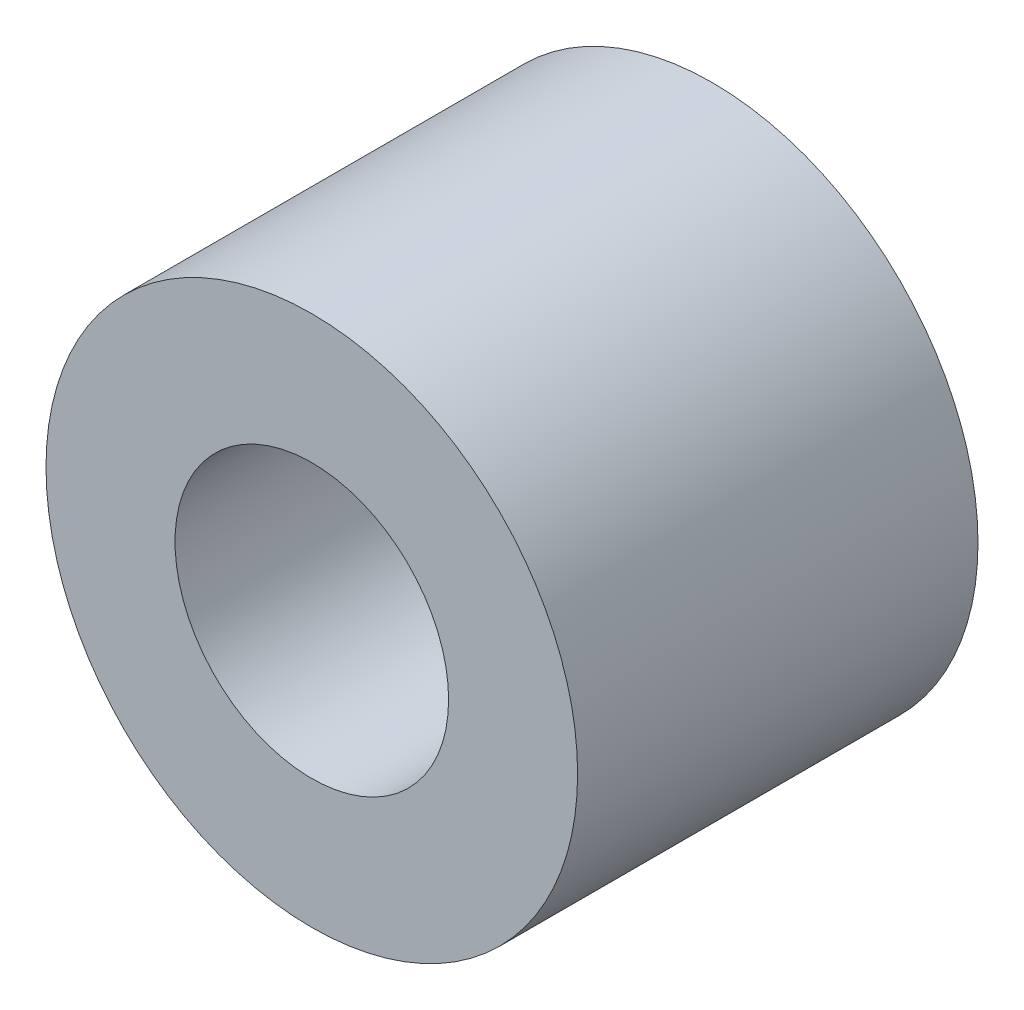
ISO-10303-21;
HEADER;
FILE_DESCRIPTION(('STEP AP214'),'2;1');
FILE_NAME('part.step','',(''),(''),'','','');
FILE_SCHEMA(('AUTOMOTIVE_DESIGN { 1 0 10303 214 1 1 1 1 }'));
ENDSEC;
DATA;
#1=APPLICATION_CONTEXT('core data for automotive mechanical design processes');
#2=APPLICATION_PROTOCOL_DEFINITION('international standard','automotive_design',2000,#1);
#3=PRODUCT_CONTEXT('',#1,'mechanical');
#4=PRODUCT('Part','Part','',(#3));
#5=PRODUCT_RELATED_PRODUCT_CATEGORY('part','',(#4));
#6=PRODUCT_DEFINITION_FORMATION('','',#4);
#7=PRODUCT_DEFINITION_CONTEXT('part definition',#1,'design');
#8=PRODUCT_DEFINITION('design','',#6,#7);
#9=PRODUCT_DEFINITION_SHAPE('','',#8);
#10=(LENGTH_UNIT() NAMED_UNIT(*) SI_UNIT(.MILLI.,.METRE.));
#11=(NAMED_UNIT(*) PLANE_ANGLE_UNIT() SI_UNIT($,.RADIAN.));
#12=(NAMED_UNIT(*) SI_UNIT($,.STERADIAN.) SOLID_ANGLE_UNIT());
#13=UNCERTAINTY_MEASURE_WITH_UNIT(LENGTH_MEASURE(1.E-05),#10,'distance_accuracy_value','');
#14=(GEOMETRIC_REPRESENTATION_CONTEXT(3) GLOBAL_UNCERTAINTY_ASSIGNED_CONTEXT((#13)) GLOBAL_UNIT_ASSIGNED_CONTEXT((#10,
#11,#12)) REPRESENTATION_CONTEXT('',''));
#15=CARTESIAN_POINT('',(0.,0.,0.));
#16=DIRECTION('',(0.,0.,1.));
#17=DIRECTION('',(1.,0.,0.));
#18=AXIS2_PLACEMENT_3D('',#15,#16,#17);
#19=CARTESIAN_POINT('',(0.,0.,18.));
#20=DIRECTION('',(0.,0.,1.));
#21=DIRECTION('',(1.,0.,0.));
#22=AXIS2_PLACEMENT_3D('',#19,#20,#21);
#23=PLANE('',#22);
#24=CARTESIAN_POINT('',(0.,0.,18.));
#25=DIRECTION('',(0.,0.,1.));
#26=DIRECTION('',(1.,0.,0.));
#27=AXIS2_PLACEMENT_3D('',#24,#25,#26);
#28=CIRCLE('',#27,11.95);
#29=CARTESIAN_POINT('',(11.95,0.,18.));
#30=VERTEX_POINT('',#29);
#31=EDGE_CURVE('E10',#30,#30,#28,.T.);
#32=ORIENTED_EDGE('',*,*,#31,.T.);
#33=EDGE_LOOP('',(#32));
#34=FACE_BOUND('',#33,.T.);
#35=CARTESIAN_POINT('',(0.,0.,18.));
#36=DIRECTION('',(0.,0.,1.));
#37=DIRECTION('',(1.,0.,0.));
#38=AXIS2_PLACEMENT_3D('',#35,#36,#37);
#39=CIRCLE('',#38,6.15);
#40=CARTESIAN_POINT('',(6.15,0.,18.));
#41=VERTEX_POINT('',#40);
#42=EDGE_CURVE('E42',#41,#41,#39,.T.);
#43=ORIENTED_EDGE('',*,*,#42,.F.);
#44=EDGE_LOOP('',(#43));
#45=FACE_BOUND('',#44,.T.);
#46=ADVANCED_FACE('F31',(#34,#45),#23,.T.);
#47=CARTESIAN_POINT('',(0.,0.,0.));
#48=DIRECTION('',(0.,0.,1.));
#49=DIRECTION('',(1.,0.,0.));
#50=AXIS2_PLACEMENT_3D('',#47,#48,#49);
#51=PLANE('',#50);
#52=CARTESIAN_POINT('',(0.,0.,0.));
#53=DIRECTION('',(0.,0.,1.));
#54=DIRECTION('',(1.,0.,0.));
#55=AXIS2_PLACEMENT_3D('',#52,#53,#54);
#56=CIRCLE('',#55,11.95);
#57=CARTESIAN_POINT('',(11.95,0.,0.));
#58=VERTEX_POINT('',#57);
#59=EDGE_CURVE('E35',#58,#58,#56,.T.);
#60=ORIENTED_EDGE('',*,*,#59,.F.);
#61=EDGE_LOOP('',(#60));
#62=FACE_BOUND('',#61,.T.);
#63=CARTESIAN_POINT('',(0.,0.,0.));
#64=DIRECTION('',(0.,0.,1.));
#65=DIRECTION('',(1.,0.,0.));
#66=AXIS2_PLACEMENT_3D('',#63,#64,#65);
#67=CIRCLE('',#66,6.15);
#68=CARTESIAN_POINT('',(6.15,0.,0.));
#69=VERTEX_POINT('',#68);
#70=EDGE_CURVE('E44',#69,#69,#67,.T.);
#71=ORIENTED_EDGE('',*,*,#70,.T.);
#72=EDGE_LOOP('',(#71));
#73=FACE_BOUND('',#72,.T.);
#74=ADVANCED_FACE('F54',(#62,#73),#51,.F.);
#75=CARTESIAN_POINT('',(0.,0.,18.));
#76=DIRECTION('',(0.,0.,-1.));
#77=DIRECTION('',(-1.,0.,0.));
#78=AXIS2_PLACEMENT_3D('',#75,#76,#77);
#79=CYLINDRICAL_SURFACE('',#78,11.95);
#80=ORIENTED_EDGE('',*,*,#31,.F.);
#81=EDGE_LOOP('',(#80));
#82=FACE_BOUND('',#81,.T.);
#83=ORIENTED_EDGE('',*,*,#59,.T.);
#84=EDGE_LOOP('',(#83));
#85=FACE_BOUND('',#84,.T.);
#86=ADVANCED_FACE('F33',(#82,#85),#79,.T.);
#87=CARTESIAN_POINT('',(0.,0.,18.));
#88=DIRECTION('',(0.,0.,-1.));
#89=DIRECTION('',(-1.,0.,0.));
#90=AXIS2_PLACEMENT_3D('',#87,#88,#89);
#91=CYLINDRICAL_SURFACE('',#90,6.15);
#92=ORIENTED_EDGE('',*,*,#42,.T.);
#93=EDGE_LOOP('',(#92));
#94=FACE_BOUND('',#93,.T.);
#95=ORIENTED_EDGE('',*,*,#70,.F.);
#96=EDGE_LOOP('',(#95));
#97=FACE_BOUND('',#96,.T.);
#98=ADVANCED_FACE('F50',(#94,#97),#91,.F.);
#99=CLOSED_SHELL('',(#46,#74,#86,#98));
#100=MANIFOLD_SOLID_BREP('B2',#99);
#101=ADVANCED_BREP_SHAPE_REPRESENTATION('',(#18,#100),#14);
#102=SHAPE_DEFINITION_REPRESENTATION(#9,#101);
ENDSEC;
END-ISO-10303-21;
